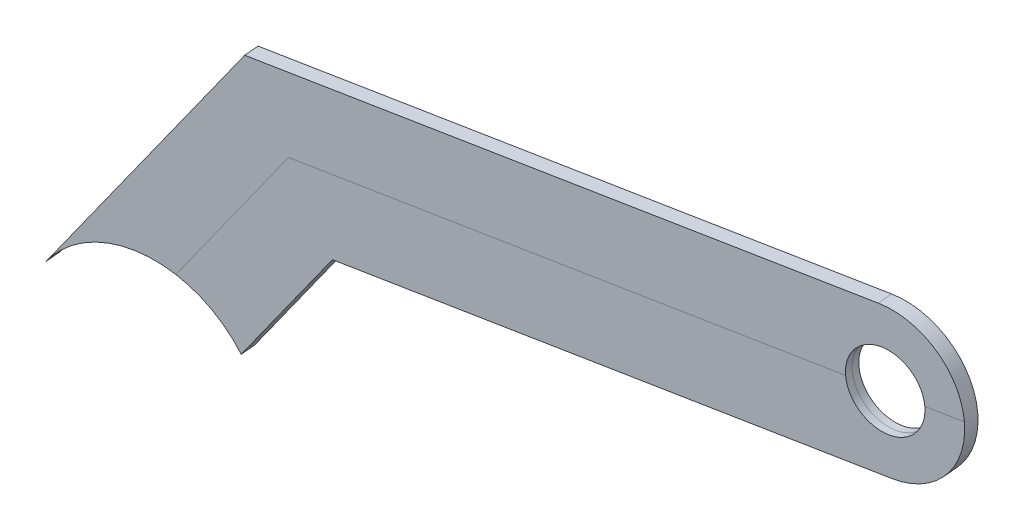
ISO-10303-21;
HEADER;
FILE_DESCRIPTION(('STEP AP214'),'2;1');
FILE_NAME('part.step','',(''),(''),'','','');
FILE_SCHEMA(('AUTOMOTIVE_DESIGN { 1 0 10303 214 1 1 1 1 }'));
ENDSEC;
DATA;
#1=APPLICATION_CONTEXT('core data for automotive mechanical design processes');
#2=APPLICATION_PROTOCOL_DEFINITION('international standard','automotive_design',2000,#1);
#3=PRODUCT_CONTEXT('',#1,'mechanical');
#4=PRODUCT('Part','Part','',(#3));
#5=PRODUCT_RELATED_PRODUCT_CATEGORY('part','',(#4));
#6=PRODUCT_DEFINITION_FORMATION('','',#4);
#7=PRODUCT_DEFINITION_CONTEXT('part definition',#1,'design');
#8=PRODUCT_DEFINITION('design','',#6,#7);
#9=PRODUCT_DEFINITION_SHAPE('','',#8);
#10=(LENGTH_UNIT() NAMED_UNIT(*) SI_UNIT(.MILLI.,.METRE.));
#11=(NAMED_UNIT(*) PLANE_ANGLE_UNIT() SI_UNIT($,.RADIAN.));
#12=(NAMED_UNIT(*) SI_UNIT($,.STERADIAN.) SOLID_ANGLE_UNIT());
#13=UNCERTAINTY_MEASURE_WITH_UNIT(LENGTH_MEASURE(1.E-05),#10,'distance_accuracy_value','');
#14=(GEOMETRIC_REPRESENTATION_CONTEXT(3) GLOBAL_UNCERTAINTY_ASSIGNED_CONTEXT((#13)) GLOBAL_UNIT_ASSIGNED_CONTEXT((#10,
#11,#12)) REPRESENTATION_CONTEXT('',''));
#15=CARTESIAN_POINT('',(0.,0.,0.));
#16=DIRECTION('',(0.,0.,1.));
#17=DIRECTION('',(1.,0.,0.));
#18=AXIS2_PLACEMENT_3D('',#15,#16,#17);
#19=CARTESIAN_POINT('',(92.7695373405345,41.2871579513113,-99.2346978016848));
#20=DIRECTION('',(0.0871557427476515,0.,0.996194698091746));
#21=DIRECTION('',(0.996194698091746,0.,-0.0871557427476515));
#22=AXIS2_PLACEMENT_3D('',#19,#20,#21);
#23=CYLINDRICAL_SURFACE('',#22,5.00000000000001);
#24=CARTESIAN_POINT('',(92.7695373405345,41.2871579513113,-99.2346978016848));
#25=DIRECTION('',(-0.0871557427476515,0.,-0.996194698091746));
#26=DIRECTION('',(-0.996194698091746,0.,0.0871557427476515));
#27=AXIS2_PLACEMENT_3D('',#24,#25,#26);
#28=CIRCLE('',#27,5.00000000000001);
#29=CARTESIAN_POINT('',(87.7885638500757,41.2871579513113,-98.7989190879466));
#30=VERTEX_POINT('',#29);
#31=EDGE_CURVE('E168',#30,#30,#28,.T.);
#32=ORIENTED_EDGE('',*,*,#31,.T.);
#33=EDGE_LOOP('',(#32));
#34=FACE_BOUND('',#33,.T.);
#35=CARTESIAN_POINT('',(92.8566930832821,41.2871579513113,-98.2385031035931));
#36=DIRECTION('',(0.0871557427476332,0.,0.996194698091748));
#37=DIRECTION('',(0.996194698091748,0.,-0.0871557427476332));
#38=AXIS2_PLACEMENT_3D('',#35,#36,#37);
#39=CIRCLE('',#38,5.00000000000001);
#40=CARTESIAN_POINT('',(97.8376665737409,41.2871579513113,-98.6742818173313));
#41=VERTEX_POINT('',#40);
#42=EDGE_CURVE('E12',#41,#41,#39,.T.);
#43=ORIENTED_EDGE('',*,*,#42,.T.);
#44=EDGE_LOOP('',(#43));
#45=FACE_BOUND('',#44,.T.);
#46=ADVANCED_FACE('F52',(#34,#45),#23,.F.);
#47=CARTESIAN_POINT('',(0.0871557427476532,0.,-89.1184004282087));
#48=DIRECTION('',(-0.0871557427476515,0.,-0.996194698091746));
#49=DIRECTION('',(-0.996194698091746,0.,0.0871557427476515));
#50=AXIS2_PLACEMENT_3D('',#47,#48,#49);
#51=PLANE('',#50);
#52=DIRECTION('',(0.571393804843271,0.819152044288992,-0.0499904803327265));
#53=VECTOR('',#52,1.);
#54=CARTESIAN_POINT('',(-4.02441283009037,2.88994843486126,-88.758684788776));
#55=LINE('',#54,#53);
#56=CARTESIAN_POINT('',(4.05094174131974,14.4668033980394,-89.4651867677265));
#57=VERTEX_POINT('',#56);
#58=CARTESIAN_POINT('',(18.1791939815165,34.7211124344528,-90.7012486741784));
#59=VERTEX_POINT('',#58);
#60=EDGE_CURVE('E62',#57,#59,#55,.T.);
#61=ORIENTED_EDGE('',*,*,#60,.F.);
#62=CARTESIAN_POINT('',(0.0871557427476532,0.,-89.1184004282087));
#63=DIRECTION('',(0.0871557427476515,0.,0.996194698091746));
#64=DIRECTION('',(-0.996194698091746,0.,0.0871557427476515));
#65=AXIS2_PLACEMENT_3D('',#62,#63,#64);
#66=ELLIPSE('',#65,15.0572975631502,15.);
#67=CARTESIAN_POINT('',(12.2472140489608,8.78253847070976,-90.1822676778165));
#68=VERTEX_POINT('',#67);
#69=EDGE_CURVE('E217',#68,#57,#66,.T.);
#70=ORIENTED_EDGE('',*,*,#69,.F.);
#71=DIRECTION('',(-0.571393804843268,-0.819152044288993,0.0499904803327261));
#72=VECTOR('',#71,1.);
#73=CARTESIAN_POINT('',(23.6750901458262,25.1655793564896,-91.1820772844711));
#74=LINE('',#73,#72);
#75=CARTESIAN_POINT('',(23.6750901458262,25.1655793564896,-91.1820772844711));
#76=VERTEX_POINT('',#75);
#77=EDGE_CURVE('E140',#76,#68,#74,.T.);
#78=ORIENTED_EDGE('',*,*,#77,.F.);
#79=DIRECTION('',(-0.992403876506105,-0.0871557427476574,0.0868240888334586));
#80=VECTOR('',#79,1.);
#81=CARTESIAN_POINT('',(93.8120897143644,31.3252109703938,-97.3182696404403));
#82=LINE('',#81,#80);
#83=CARTESIAN_POINT('',(93.8120897143644,31.3252109703938,-97.3182696404403));
#84=VERTEX_POINT('',#83);
#85=EDGE_CURVE('E204',#84,#76,#82,.T.);
#86=ORIENTED_EDGE('',*,*,#85,.F.);
#87=CARTESIAN_POINT('',(92.9438488260298,41.2871579513113,-97.2423084055013));
#88=DIRECTION('',(-0.0871557427476515,0.,-0.996194698091746));
#89=DIRECTION('',(-0.996194698091746,0.,0.0871557427476515));
#90=AXIS2_PLACEMENT_3D('',#87,#88,#89);
#91=CIRCLE('',#90,10.);
#92=CARTESIAN_POINT('',(102.867887591091,42.1587153787878,-98.1105492938359));
#93=VERTEX_POINT('',#92);
#94=EDGE_CURVE('E205',#93,#84,#91,.T.);
#95=ORIENTED_EDGE('',*,*,#94,.F.);
#96=DIRECTION('',(0.992403876506105,0.0871557427476574,-0.0868240888334585));
#97=VECTOR('',#96,1.);
#98=CARTESIAN_POINT('',(-2.77857227764236,32.8805415460364,-88.867681713676));
#99=LINE('',#98,#97);
#100=CARTESIAN_POINT('',(97.9058682085603,41.7229366650496,-97.6764288496687));
#101=VERTEX_POINT('',#100);
#102=EDGE_CURVE('E144',#101,#93,#99,.T.);
#103=ORIENTED_EDGE('',*,*,#102,.F.);
#104=CARTESIAN_POINT('',(92.9438488260298,41.2871579513113,-97.2423084055013));
#105=DIRECTION('',(-0.0871557427476515,0.,-0.996194698091746));
#106=DIRECTION('',(-0.996194698091746,0.,0.0871557427476515));
#107=AXIS2_PLACEMENT_3D('',#104,#105,#106);
#108=CIRCLE('',#107,5.00000000000001);
#109=CARTESIAN_POINT('',(87.9818294434993,40.851379237573,-96.8081879613341));
#110=VERTEX_POINT('',#109);
#111=EDGE_CURVE('E165',#101,#110,#108,.T.);
#112=ORIENTED_EDGE('',*,*,#111,.T.);
#113=DIRECTION('',(0.992403876506105,0.0871557427476583,-0.0868240888334585));
#114=VECTOR('',#113,1.);
#115=CARTESIAN_POINT('',(-2.77857227764238,32.8805415460363,-88.867681713676));
#116=LINE('',#115,#114);
#117=EDGE_CURVE('E72',#59,#110,#116,.T.);
#118=ORIENTED_EDGE('',*,*,#117,.F.);
#119=EDGE_LOOP('',(#61,#70,#78,#86,#95,#103,#112,#118));
#120=FACE_BOUND('',#119,.T.);
#121=ADVANCED_FACE('F218',(#120),#51,.F.);
#122=CARTESIAN_POINT('',(-0.0871557427476498,0.,-91.1107898243922));
#123=DIRECTION('',(-0.0871557427476515,0.,-0.996194698091746));
#124=DIRECTION('',(-0.996194698091746,0.,0.0871557427476515));
#125=AXIS2_PLACEMENT_3D('',#122,#123,#124);
#126=PLANE('',#125);
#127=CARTESIAN_POINT('',(-0.0871557427476498,0.,-91.1107898243922));
#128=DIRECTION('',(0.0871557427476515,0.,0.996194698091746));
#129=DIRECTION('',(-0.996194698091746,0.,0.0871557427476515));
#130=AXIS2_PLACEMENT_3D('',#127,#128,#129);
#131=ELLIPSE('',#130,15.0572975631502,15.);
#132=CARTESIAN_POINT('',(12.0729025634655,8.78253847070976,-92.174657074));
#133=VERTEX_POINT('',#132);
#134=CARTESIAN_POINT('',(-12.3898184963762,8.58163674193227,-90.0344463022672));
#135=VERTEX_POINT('',#134);
#136=EDGE_CURVE('E130',#133,#135,#131,.T.);
#137=ORIENTED_EDGE('',*,*,#136,.T.);
#138=DIRECTION('',(0.571393804843268,0.819152044288993,-0.0499904803327263));
#139=VECTOR('',#138,1.);
#140=CARTESIAN_POINT('',(-12.3898184963762,8.58163674193227,-90.0344463022672));
#141=LINE('',#140,#139);
#142=CARTESIAN_POINT('',(12.5089863317114,44.2766455124161,-92.2128094600692));
#143=VERTEX_POINT('',#142);
#144=EDGE_CURVE('E120',#135,#143,#141,.T.);
#145=ORIENTED_EDGE('',*,*,#144,.T.);
#146=DIRECTION('',(0.992403876506105,0.0871557427476575,-0.0868240888334584));
#147=VECTOR('',#146,1.);
#148=CARTESIAN_POINT('',(12.5089863317114,44.2766455124161,-92.2128094600692));
#149=LINE('',#148,#147);
#150=CARTESIAN_POINT('',(91.9012964521998,51.2491049322287,-99.1587365667459));
#151=VERTEX_POINT('',#150);
#152=EDGE_CURVE('E129',#143,#151,#149,.T.);
#153=ORIENTED_EDGE('',*,*,#152,.T.);
#154=CARTESIAN_POINT('',(92.7695373405345,41.2871579513113,-99.2346978016848));
#155=DIRECTION('',(-0.0871557427476515,0.,-0.996194698091746));
#156=DIRECTION('',(-0.996194698091746,0.,0.0871557427476515));
#157=AXIS2_PLACEMENT_3D('',#154,#155,#156);
#158=CIRCLE('',#157,10.);
#159=CARTESIAN_POINT('',(93.6377782288691,31.3252109703938,-99.3106590366238));
#160=VERTEX_POINT('',#159);
#161=EDGE_CURVE('E198',#151,#160,#158,.T.);
#162=ORIENTED_EDGE('',*,*,#161,.T.);
#163=DIRECTION('',(-0.992403876506105,-0.0871557427476574,0.0868240888334586));
#164=VECTOR('',#163,1.);
#165=CARTESIAN_POINT('',(93.6377782288691,31.3252109703938,-99.3106590366238));
#166=LINE('',#165,#164);
#167=CARTESIAN_POINT('',(23.5007786603309,25.1655793564896,-93.1744666806545));
#168=VERTEX_POINT('',#167);
#169=EDGE_CURVE('E223',#160,#168,#166,.T.);
#170=ORIENTED_EDGE('',*,*,#169,.T.);
#171=DIRECTION('',(-0.571393804843268,-0.819152044288993,0.0499904803327261));
#172=VECTOR('',#171,1.);
#173=CARTESIAN_POINT('',(23.5007786603309,25.1655793564896,-93.1744666806545));
#174=LINE('',#173,#172);
#175=EDGE_CURVE('E136',#168,#133,#174,.T.);
#176=ORIENTED_EDGE('',*,*,#175,.T.);
#177=EDGE_LOOP('',(#137,#145,#153,#162,#170,#176));
#178=FACE_BOUND('',#177,.T.);
#179=ORIENTED_EDGE('',*,*,#31,.F.);
#180=EDGE_LOOP('',(#179));
#181=FACE_BOUND('',#180,.T.);
#182=ADVANCED_FACE('F133',(#178,#181),#126,.T.);
#183=CARTESIAN_POINT('',(-12.2155070108809,8.58163674193227,-88.0420569060837));
#184=VERTEX_POINT('',#183);
#185=EDGE_CURVE('E142',#57,#184,#66,.T.);
#186=ORIENTED_EDGE('',*,*,#185,.F.);
#187=ORIENTED_EDGE('',*,*,#60,.T.);
#188=ORIENTED_EDGE('',*,*,#117,.T.);
#189=EDGE_CURVE('E169',#110,#101,#108,.T.);
#190=ORIENTED_EDGE('',*,*,#189,.T.);
#191=ORIENTED_EDGE('',*,*,#102,.T.);
#192=CARTESIAN_POINT('',(92.0756079376951,51.2491049322287,-97.1663471705624));
#193=VERTEX_POINT('',#192);
#194=EDGE_CURVE('E196',#193,#93,#91,.T.);
#195=ORIENTED_EDGE('',*,*,#194,.F.);
#196=DIRECTION('',(0.992403876506105,0.0871557427476575,-0.0868240888334584));
#197=VECTOR('',#196,1.);
#198=CARTESIAN_POINT('',(12.6832978172067,44.2766455124161,-90.2204200638857));
#199=LINE('',#198,#197);
#200=CARTESIAN_POINT('',(12.6832978172067,44.2766455124161,-90.2204200638857));
#201=VERTEX_POINT('',#200);
#202=EDGE_CURVE('E202',#201,#193,#199,.T.);
#203=ORIENTED_EDGE('',*,*,#202,.F.);
#204=DIRECTION('',(0.571393804843268,0.819152044288993,-0.0499904803327263));
#205=VECTOR('',#204,1.);
#206=CARTESIAN_POINT('',(-12.2155070108809,8.58163674193227,-88.0420569060837));
#207=LINE('',#206,#205);
#208=EDGE_CURVE('E219',#184,#201,#207,.T.);
#209=ORIENTED_EDGE('',*,*,#208,.F.);
#210=EDGE_LOOP('',(#186,#187,#188,#190,#191,#195,#203,#209));
#211=FACE_BOUND('',#210,.T.);
#212=ADVANCED_FACE('F201',(#211),#51,.F.);
#213=DIRECTION('',(0.0871557427476515,0.,0.996194698091746));
#214=VECTOR('',#213,1.);
#215=SURFACE_OF_LINEAR_EXTRUSION('',#131,#214);
#216=ORIENTED_EDGE('',*,*,#69,.T.);
#217=ORIENTED_EDGE('',*,*,#185,.T.);
#218=DIRECTION('',(0.0871557427476515,0.,0.996194698091746));
#219=VECTOR('',#218,1.);
#220=CARTESIAN_POINT('',(-12.3898184963762,8.58163674193227,-90.0344463022672));
#221=LINE('',#220,#219);
#222=EDGE_CURVE('E124',#135,#184,#221,.T.);
#223=ORIENTED_EDGE('',*,*,#222,.F.);
#224=ORIENTED_EDGE('',*,*,#136,.F.);
#225=DIRECTION('',(0.0871557427476515,0.,0.996194698091746));
#226=VECTOR('',#225,1.);
#227=CARTESIAN_POINT('',(12.0729025634655,8.78253847070976,-92.174657074));
#228=LINE('',#227,#226);
#229=EDGE_CURVE('E186',#133,#68,#228,.T.);
#230=ORIENTED_EDGE('',*,*,#229,.T.);
#231=EDGE_LOOP('',(#216,#217,#223,#224,#230));
#232=FACE_BOUND('',#231,.T.);
#233=ADVANCED_FACE('F54',(#232),#215,.F.);
#234=CARTESIAN_POINT('',(-12.3898184963762,8.58163674193227,-90.0344463022672));
#235=DIRECTION('',(0.81603492345171,-0.573576436351044,-0.0713938048432643));
#236=DIRECTION('',(0.575043829463067,0.818122603401502,0.));
#237=AXIS2_PLACEMENT_3D('',#234,#235,#236);
#238=PLANE('',#237);
#239=ORIENTED_EDGE('',*,*,#208,.T.);
#240=DIRECTION('',(0.0871557427476515,0.,0.996194698091746));
#241=VECTOR('',#240,1.);
#242=CARTESIAN_POINT('',(12.5089863317114,44.2766455124161,-92.2128094600692));
#243=LINE('',#242,#241);
#244=EDGE_CURVE('E126',#143,#201,#243,.T.);
#245=ORIENTED_EDGE('',*,*,#244,.F.);
#246=ORIENTED_EDGE('',*,*,#144,.F.);
#247=ORIENTED_EDGE('',*,*,#222,.T.);
#248=EDGE_LOOP('',(#239,#245,#246,#247));
#249=FACE_BOUND('',#248,.T.);
#250=ADVANCED_FACE('F122',(#249),#238,.F.);
#251=CARTESIAN_POINT('',(12.5089863317114,44.2766455124161,-92.2128094600692));
#252=DIRECTION('',(0.0868240888334646,-0.996194698091746,-0.00759612349389533));
#253=DIRECTION('',(0.996223440096615,0.086826593864247,0.));
#254=AXIS2_PLACEMENT_3D('',#251,#252,#253);
#255=PLANE('',#254);
#256=ORIENTED_EDGE('',*,*,#202,.T.);
#257=DIRECTION('',(0.0871557427476515,0.,0.996194698091746));
#258=VECTOR('',#257,1.);
#259=CARTESIAN_POINT('',(91.9012964521998,51.2491049322287,-99.1587365667459));
#260=LINE('',#259,#258);
#261=EDGE_CURVE('E148',#151,#193,#260,.T.);
#262=ORIENTED_EDGE('',*,*,#261,.F.);
#263=ORIENTED_EDGE('',*,*,#152,.F.);
#264=ORIENTED_EDGE('',*,*,#244,.T.);
#265=EDGE_LOOP('',(#256,#262,#263,#264));
#266=FACE_BOUND('',#265,.T.);
#267=ADVANCED_FACE('F226',(#266),#255,.F.);
#268=CARTESIAN_POINT('',(92.7695373405345,41.2871579513113,-99.2346978016848));
#269=DIRECTION('',(0.0871557427476515,0.,0.996194698091746));
#270=DIRECTION('',(0.996194698091746,0.,-0.0871557427476515));
#271=AXIS2_PLACEMENT_3D('',#268,#269,#270);
#272=CYLINDRICAL_SURFACE('',#271,10.);
#273=ORIENTED_EDGE('',*,*,#194,.T.);
#274=ORIENTED_EDGE('',*,*,#94,.T.);
#275=DIRECTION('',(0.0871557427476515,0.,0.996194698091746));
#276=VECTOR('',#275,1.);
#277=CARTESIAN_POINT('',(93.6377782288691,31.3252109703938,-99.3106590366238));
#278=LINE('',#277,#276);
#279=EDGE_CURVE('E185',#160,#84,#278,.T.);
#280=ORIENTED_EDGE('',*,*,#279,.F.);
#281=ORIENTED_EDGE('',*,*,#161,.F.);
#282=ORIENTED_EDGE('',*,*,#261,.T.);
#283=EDGE_LOOP('',(#273,#274,#280,#281,#282));
#284=FACE_BOUND('',#283,.T.);
#285=ADVANCED_FACE('F195',(#284),#272,.T.);
#286=CARTESIAN_POINT('',(93.6377782288691,31.3252109703938,-99.3106590366238));
#287=DIRECTION('',(-0.0868240888334644,0.996194698091746,0.00759612349389532));
#288=DIRECTION('',(-0.996223440096615,-0.0868265938642469,0.));
#289=AXIS2_PLACEMENT_3D('',#286,#287,#288);
#290=PLANE('',#289);
#291=ORIENTED_EDGE('',*,*,#85,.T.);
#292=DIRECTION('',(0.0871557427476515,0.,0.996194698091746));
#293=VECTOR('',#292,1.);
#294=CARTESIAN_POINT('',(23.5007786603309,25.1655793564896,-93.1744666806545));
#295=LINE('',#294,#293);
#296=EDGE_CURVE('E180',#168,#76,#295,.T.);
#297=ORIENTED_EDGE('',*,*,#296,.F.);
#298=ORIENTED_EDGE('',*,*,#169,.F.);
#299=ORIENTED_EDGE('',*,*,#279,.T.);
#300=EDGE_LOOP('',(#291,#297,#298,#299));
#301=FACE_BOUND('',#300,.T.);
#302=ADVANCED_FACE('F235',(#301),#290,.F.);
#303=CARTESIAN_POINT('',(23.5007786603309,25.1655793564896,-93.1744666806545));
#304=DIRECTION('',(-0.81603492345171,0.573576436351044,0.0713938048432643));
#305=DIRECTION('',(-0.575043829463067,-0.818122603401502,0.));
#306=AXIS2_PLACEMENT_3D('',#303,#304,#305);
#307=PLANE('',#306);
#308=ORIENTED_EDGE('',*,*,#77,.T.);
#309=ORIENTED_EDGE('',*,*,#229,.F.);
#310=ORIENTED_EDGE('',*,*,#175,.F.);
#311=ORIENTED_EDGE('',*,*,#296,.T.);
#312=EDGE_LOOP('',(#308,#309,#310,#311));
#313=FACE_BOUND('',#312,.T.);
#314=ADVANCED_FACE('F212',(#313),#307,.F.);
#315=ORIENTED_EDGE('',*,*,#42,.F.);
#316=EDGE_LOOP('',(#315));
#317=FACE_BOUND('',#316,.T.);
#318=ORIENTED_EDGE('',*,*,#111,.F.);
#319=ORIENTED_EDGE('',*,*,#189,.F.);
#320=EDGE_LOOP('',(#318,#319));
#321=FACE_BOUND('',#320,.T.);
#322=ADVANCED_FACE('F240',(#317,#321),#23,.F.);
#323=CLOSED_SHELL('',(#46,#121,#182,#212,#233,#250,#267,#285,#302,#314,#322));
#324=MANIFOLD_SOLID_BREP('B2',#323);
#325=ADVANCED_BREP_SHAPE_REPRESENTATION('',(#18,#324),#14);
#326=SHAPE_DEFINITION_REPRESENTATION(#9,#325);
ENDSEC;
END-ISO-10303-21;
